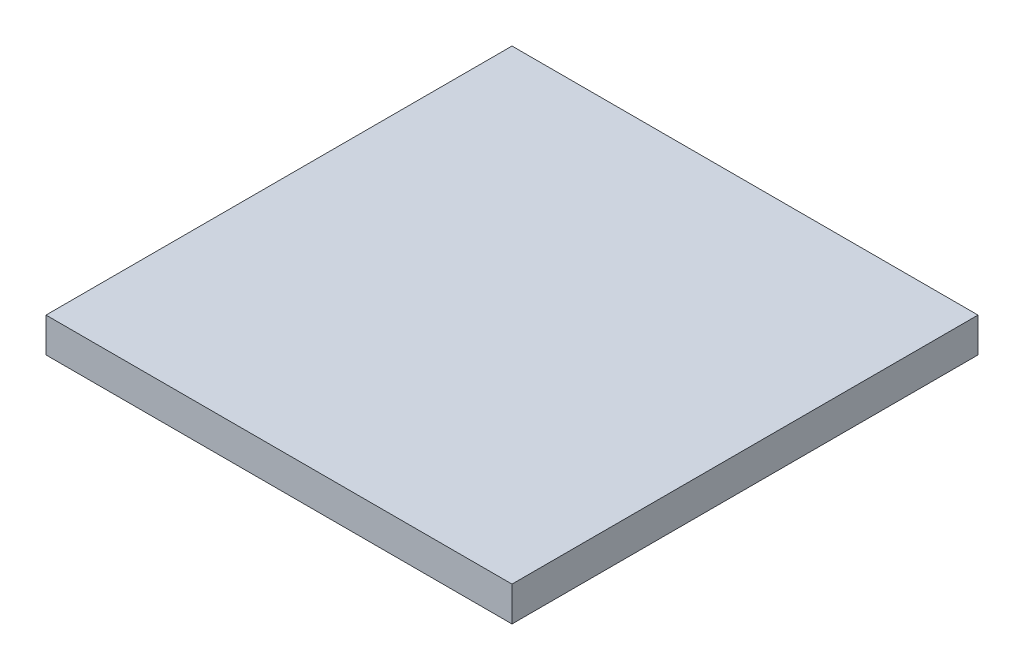
ISO-10303-21;
HEADER;
FILE_DESCRIPTION(('STEP AP214'),'2;1');
FILE_NAME('part.step','',(''),(''),'','','');
FILE_SCHEMA(('AUTOMOTIVE_DESIGN { 1 0 10303 214 1 1 1 1 }'));
ENDSEC;
DATA;
#1=APPLICATION_CONTEXT('core data for automotive mechanical design processes');
#2=APPLICATION_PROTOCOL_DEFINITION('international standard','automotive_design',2000,#1);
#3=PRODUCT_CONTEXT('',#1,'mechanical');
#4=PRODUCT('Part','Part','',(#3));
#5=PRODUCT_RELATED_PRODUCT_CATEGORY('part','',(#4));
#6=PRODUCT_DEFINITION_FORMATION('','',#4);
#7=PRODUCT_DEFINITION_CONTEXT('part definition',#1,'design');
#8=PRODUCT_DEFINITION('design','',#6,#7);
#9=PRODUCT_DEFINITION_SHAPE('','',#8);
#10=(LENGTH_UNIT() NAMED_UNIT(*) SI_UNIT(.MILLI.,.METRE.));
#11=(NAMED_UNIT(*) PLANE_ANGLE_UNIT() SI_UNIT($,.RADIAN.));
#12=(NAMED_UNIT(*) SI_UNIT($,.STERADIAN.) SOLID_ANGLE_UNIT());
#13=UNCERTAINTY_MEASURE_WITH_UNIT(LENGTH_MEASURE(1.E-05),#10,'distance_accuracy_value','');
#14=(GEOMETRIC_REPRESENTATION_CONTEXT(3) GLOBAL_UNCERTAINTY_ASSIGNED_CONTEXT((#13)) GLOBAL_UNIT_ASSIGNED_CONTEXT((#10,
#11,#12)) REPRESENTATION_CONTEXT('',''));
#15=CARTESIAN_POINT('',(0.,0.,0.));
#16=DIRECTION('',(0.,0.,1.));
#17=DIRECTION('',(1.,0.,0.));
#18=AXIS2_PLACEMENT_3D('',#15,#16,#17);
#19=CARTESIAN_POINT('',(-9.575,1.42,9.575));
#20=DIRECTION('',(1.,0.,0.));
#21=DIRECTION('',(0.,0.,-1.));
#22=AXIS2_PLACEMENT_3D('',#19,#20,#21);
#23=PLANE('',#22);
#24=DIRECTION('',(0.,0.,1.));
#25=VECTOR('',#24,1.);
#26=CARTESIAN_POINT('',(-9.575,0.,9.575));
#27=LINE('',#26,#25);
#28=CARTESIAN_POINT('',(-9.575,0.,-9.575));
#29=VERTEX_POINT('',#28);
#30=CARTESIAN_POINT('',(-9.575,0.,9.575));
#31=VERTEX_POINT('',#30);
#32=EDGE_CURVE('E97',#29,#31,#27,.T.);
#33=ORIENTED_EDGE('',*,*,#32,.T.);
#34=DIRECTION('',(0.,-1.,0.));
#35=VECTOR('',#34,1.);
#36=CARTESIAN_POINT('',(-9.575,1.42,9.575));
#37=LINE('',#36,#35);
#38=CARTESIAN_POINT('',(-9.575,1.42,9.575));
#39=VERTEX_POINT('',#38);
#40=EDGE_CURVE('E11',#39,#31,#37,.T.);
#41=ORIENTED_EDGE('',*,*,#40,.F.);
#42=DIRECTION('',(0.,0.,1.));
#43=VECTOR('',#42,1.);
#44=CARTESIAN_POINT('',(-9.575,1.42,9.575));
#45=LINE('',#44,#43);
#46=CARTESIAN_POINT('',(-9.575,1.42,-9.575));
#47=VERTEX_POINT('',#46);
#48=EDGE_CURVE('E85',#47,#39,#45,.T.);
#49=ORIENTED_EDGE('',*,*,#48,.F.);
#50=DIRECTION('',(0.,-1.,0.));
#51=VECTOR('',#50,1.);
#52=CARTESIAN_POINT('',(-9.575,1.42,-9.575));
#53=LINE('',#52,#51);
#54=EDGE_CURVE('E93',#47,#29,#53,.T.);
#55=ORIENTED_EDGE('',*,*,#54,.T.);
#56=EDGE_LOOP('',(#33,#41,#49,#55));
#57=FACE_BOUND('',#56,.T.);
#58=ADVANCED_FACE('F34',(#57),#23,.F.);
#59=CARTESIAN_POINT('',(9.575,1.42,9.575));
#60=DIRECTION('',(0.,0.,-1.));
#61=DIRECTION('',(-1.,0.,0.));
#62=AXIS2_PLACEMENT_3D('',#59,#60,#61);
#63=PLANE('',#62);
#64=DIRECTION('',(1.,0.,0.));
#65=VECTOR('',#64,1.);
#66=CARTESIAN_POINT('',(9.575,0.,9.575));
#67=LINE('',#66,#65);
#68=CARTESIAN_POINT('',(9.575,0.,9.575));
#69=VERTEX_POINT('',#68);
#70=EDGE_CURVE('E89',#31,#69,#67,.T.);
#71=ORIENTED_EDGE('',*,*,#70,.T.);
#72=DIRECTION('',(0.,-1.,0.));
#73=VECTOR('',#72,1.);
#74=CARTESIAN_POINT('',(9.575,1.42,9.575));
#75=LINE('',#74,#73);
#76=CARTESIAN_POINT('',(9.575,1.42,9.575));
#77=VERTEX_POINT('',#76);
#78=EDGE_CURVE('E42',#77,#69,#75,.T.);
#79=ORIENTED_EDGE('',*,*,#78,.F.);
#80=DIRECTION('',(1.,0.,0.));
#81=VECTOR('',#80,1.);
#82=CARTESIAN_POINT('',(9.575,1.42,9.575));
#83=LINE('',#82,#81);
#84=EDGE_CURVE('E80',#39,#77,#83,.T.);
#85=ORIENTED_EDGE('',*,*,#84,.F.);
#86=ORIENTED_EDGE('',*,*,#40,.T.);
#87=EDGE_LOOP('',(#71,#79,#85,#86));
#88=FACE_BOUND('',#87,.T.);
#89=ADVANCED_FACE('F88',(#88),#63,.F.);
#90=CARTESIAN_POINT('',(9.575,1.42,9.575));
#91=DIRECTION('',(-1.,0.,0.));
#92=DIRECTION('',(0.,0.,1.));
#93=AXIS2_PLACEMENT_3D('',#90,#91,#92);
#94=PLANE('',#93);
#95=DIRECTION('',(0.,0.,-1.));
#96=VECTOR('',#95,1.);
#97=CARTESIAN_POINT('',(9.575,0.,9.575));
#98=LINE('',#97,#96);
#99=CARTESIAN_POINT('',(9.575,0.,-9.575));
#100=VERTEX_POINT('',#99);
#101=EDGE_CURVE('E67',#69,#100,#98,.T.);
#102=ORIENTED_EDGE('',*,*,#101,.T.);
#103=DIRECTION('',(0.,-1.,0.));
#104=VECTOR('',#103,1.);
#105=CARTESIAN_POINT('',(9.575,1.42,-9.575));
#106=LINE('',#105,#104);
#107=CARTESIAN_POINT('',(9.575,1.42,-9.575));
#108=VERTEX_POINT('',#107);
#109=EDGE_CURVE('E90',#108,#100,#106,.T.);
#110=ORIENTED_EDGE('',*,*,#109,.F.);
#111=DIRECTION('',(0.,0.,-1.));
#112=VECTOR('',#111,1.);
#113=CARTESIAN_POINT('',(9.575,1.42,9.575));
#114=LINE('',#113,#112);
#115=EDGE_CURVE('E83',#77,#108,#114,.T.);
#116=ORIENTED_EDGE('',*,*,#115,.F.);
#117=ORIENTED_EDGE('',*,*,#78,.T.);
#118=EDGE_LOOP('',(#102,#110,#116,#117));
#119=FACE_BOUND('',#118,.T.);
#120=ADVANCED_FACE('F91',(#119),#94,.F.);
#121=CARTESIAN_POINT('',(9.575,1.42,-9.575));
#122=DIRECTION('',(0.,0.,1.));
#123=DIRECTION('',(1.,0.,0.));
#124=AXIS2_PLACEMENT_3D('',#121,#122,#123);
#125=PLANE('',#124);
#126=DIRECTION('',(-1.,0.,0.));
#127=VECTOR('',#126,1.);
#128=CARTESIAN_POINT('',(9.575,0.,-9.575));
#129=LINE('',#128,#127);
#130=EDGE_CURVE('E73',#100,#29,#129,.T.);
#131=ORIENTED_EDGE('',*,*,#130,.T.);
#132=ORIENTED_EDGE('',*,*,#54,.F.);
#133=DIRECTION('',(-1.,0.,0.));
#134=VECTOR('',#133,1.);
#135=CARTESIAN_POINT('',(9.575,1.42,-9.575));
#136=LINE('',#135,#134);
#137=EDGE_CURVE('E50',#108,#47,#136,.T.);
#138=ORIENTED_EDGE('',*,*,#137,.F.);
#139=ORIENTED_EDGE('',*,*,#109,.T.);
#140=EDGE_LOOP('',(#131,#132,#138,#139));
#141=FACE_BOUND('',#140,.T.);
#142=ADVANCED_FACE('F104',(#141),#125,.F.);
#143=CARTESIAN_POINT('',(0.,1.42,0.));
#144=DIRECTION('',(0.,1.,0.));
#145=DIRECTION('',(0.,0.,1.));
#146=AXIS2_PLACEMENT_3D('',#143,#144,#145);
#147=PLANE('',#146);
#148=ORIENTED_EDGE('',*,*,#48,.T.);
#149=ORIENTED_EDGE('',*,*,#84,.T.);
#150=ORIENTED_EDGE('',*,*,#115,.T.);
#151=ORIENTED_EDGE('',*,*,#137,.T.);
#152=EDGE_LOOP('',(#148,#149,#150,#151));
#153=FACE_BOUND('',#152,.T.);
#154=ADVANCED_FACE('F81',(#153),#147,.T.);
#155=CARTESIAN_POINT('',(0.,0.,0.));
#156=DIRECTION('',(0.,1.,0.));
#157=DIRECTION('',(0.,0.,1.));
#158=AXIS2_PLACEMENT_3D('',#155,#156,#157);
#159=PLANE('',#158);
#160=ORIENTED_EDGE('',*,*,#32,.F.);
#161=ORIENTED_EDGE('',*,*,#130,.F.);
#162=ORIENTED_EDGE('',*,*,#101,.F.);
#163=ORIENTED_EDGE('',*,*,#70,.F.);
#164=EDGE_LOOP('',(#160,#161,#162,#163));
#165=FACE_BOUND('',#164,.T.);
#166=ADVANCED_FACE('F107',(#165),#159,.F.);
#167=CLOSED_SHELL('',(#58,#89,#120,#142,#154,#166));
#168=MANIFOLD_SOLID_BREP('B2',#167);
#169=ADVANCED_BREP_SHAPE_REPRESENTATION('',(#18,#168),#14);
#170=SHAPE_DEFINITION_REPRESENTATION(#9,#169);
ENDSEC;
END-ISO-10303-21;
